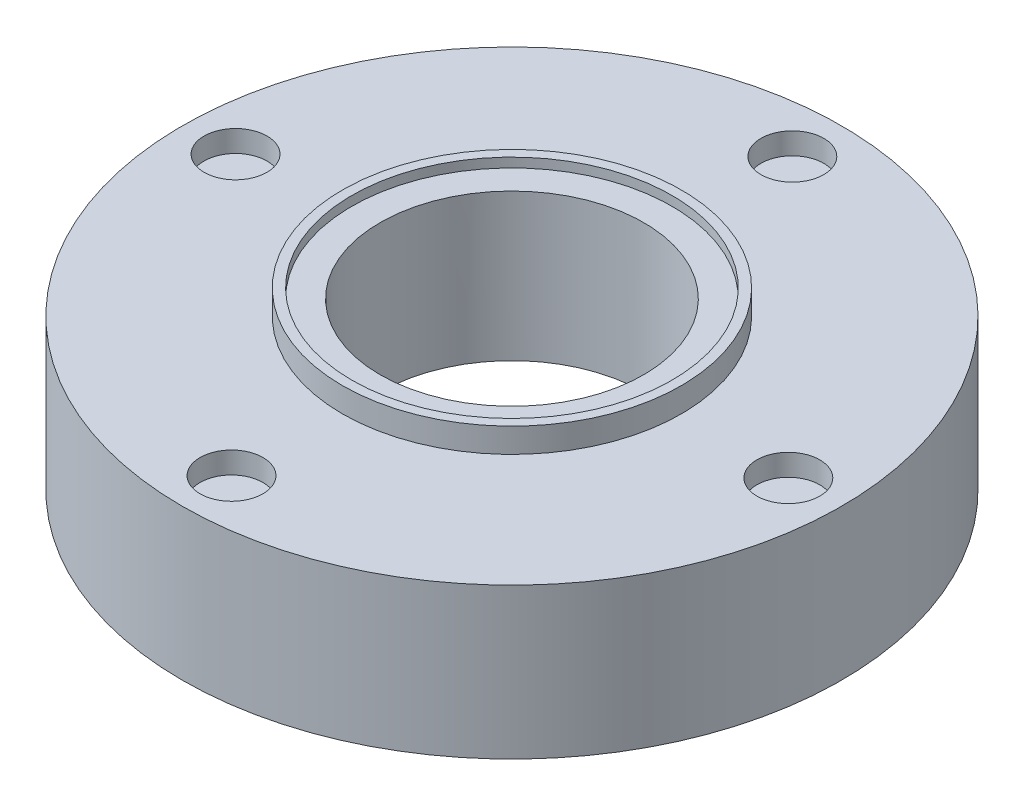
ISO-10303-21;
HEADER;
FILE_DESCRIPTION(('STEP AP214'),'2;1');
FILE_NAME('part.step','',(''),(''),'','','');
FILE_SCHEMA(('AUTOMOTIVE_DESIGN { 1 0 10303 214 1 1 1 1 }'));
ENDSEC;
DATA;
#1=APPLICATION_CONTEXT('core data for automotive mechanical design processes');
#2=APPLICATION_PROTOCOL_DEFINITION('international standard','automotive_design',2000,#1);
#3=PRODUCT_CONTEXT('',#1,'mechanical');
#4=PRODUCT('Part','Part','',(#3));
#5=PRODUCT_RELATED_PRODUCT_CATEGORY('part','',(#4));
#6=PRODUCT_DEFINITION_FORMATION('','',#4);
#7=PRODUCT_DEFINITION_CONTEXT('part definition',#1,'design');
#8=PRODUCT_DEFINITION('design','',#6,#7);
#9=PRODUCT_DEFINITION_SHAPE('','',#8);
#10=(LENGTH_UNIT() NAMED_UNIT(*) SI_UNIT(.MILLI.,.METRE.));
#11=(NAMED_UNIT(*) PLANE_ANGLE_UNIT() SI_UNIT($,.RADIAN.));
#12=(NAMED_UNIT(*) SI_UNIT($,.STERADIAN.) SOLID_ANGLE_UNIT());
#13=UNCERTAINTY_MEASURE_WITH_UNIT(LENGTH_MEASURE(1.E-05),#10,'distance_accuracy_value','');
#14=(GEOMETRIC_REPRESENTATION_CONTEXT(3) GLOBAL_UNCERTAINTY_ASSIGNED_CONTEXT((#13)) GLOBAL_UNIT_ASSIGNED_CONTEXT((#10,
#11,#12)) REPRESENTATION_CONTEXT('',''));
#15=CARTESIAN_POINT('',(0.,0.,0.));
#16=DIRECTION('',(0.,0.,1.));
#17=DIRECTION('',(1.,0.,0.));
#18=AXIS2_PLACEMENT_3D('',#15,#16,#17);
#19=CARTESIAN_POINT('',(0.,8.,0.));
#20=DIRECTION('',(0.,1.,0.));
#21=DIRECTION('',(0.,0.,1.));
#22=AXIS2_PLACEMENT_3D('',#19,#20,#21);
#23=PLANE('',#22);
#24=CARTESIAN_POINT('',(14.7834126807695,8.,0.106708515967393));
#25=DIRECTION('',(0.,1.,0.));
#26=DIRECTION('',(-1.,0.,0.));
#27=AXIS2_PLACEMENT_3D('',#24,#25,#26);
#28=CIRCLE('',#27,1.67);
#29=CARTESIAN_POINT('',(13.1134126807695,8.,0.106708515967411));
#30=VERTEX_POINT('',#29);
#31=EDGE_CURVE('E77',#30,#30,#28,.T.);
#32=ORIENTED_EDGE('',*,*,#31,.F.);
#33=EDGE_LOOP('',(#32));
#34=FACE_BOUND('',#33,.T.);
#35=CARTESIAN_POINT('',(-0.106708515967548,8.,14.7834126807695));
#36=DIRECTION('',(0.,1.,0.));
#37=DIRECTION('',(0.,0.,-1.));
#38=AXIS2_PLACEMENT_3D('',#35,#36,#37);
#39=CIRCLE('',#38,1.67);
#40=CARTESIAN_POINT('',(-0.106708515967548,8.,13.1134126807695));
#41=VERTEX_POINT('',#40);
#42=EDGE_CURVE('E71',#41,#41,#39,.T.);
#43=ORIENTED_EDGE('',*,*,#42,.F.);
#44=EDGE_LOOP('',(#43));
#45=FACE_BOUND('',#44,.T.);
#46=CARTESIAN_POINT('',(-14.7834126807695,8.,-0.106708515967496));
#47=DIRECTION('',(0.,1.,0.));
#48=DIRECTION('',(1.,0.,0.));
#49=AXIS2_PLACEMENT_3D('',#46,#47,#48);
#50=CIRCLE('',#49,1.67);
#51=CARTESIAN_POINT('',(-13.1134126807695,8.,-0.106708515967502));
#52=VERTEX_POINT('',#51);
#53=EDGE_CURVE('E65',#52,#52,#50,.T.);
#54=ORIENTED_EDGE('',*,*,#53,.F.);
#55=EDGE_LOOP('',(#54));
#56=FACE_BOUND('',#55,.T.);
#57=CARTESIAN_POINT('',(0.106708515967548,8.,-14.7834126807695));
#58=DIRECTION('',(0.,1.,0.));
#59=DIRECTION('',(0.,0.,1.));
#60=AXIS2_PLACEMENT_3D('',#57,#58,#59);
#61=CIRCLE('',#60,1.67);
#62=CARTESIAN_POINT('',(0.106708515967548,8.,-13.1134126807695));
#63=VERTEX_POINT('',#62);
#64=EDGE_CURVE('E59',#63,#63,#61,.T.);
#65=ORIENTED_EDGE('',*,*,#64,.F.);
#66=EDGE_LOOP('',(#65));
#67=FACE_BOUND('',#66,.T.);
#68=CARTESIAN_POINT('',(0.,8.,0.));
#69=DIRECTION('',(0.,1.,0.));
#70=DIRECTION('',(0.,0.,1.));
#71=AXIS2_PLACEMENT_3D('',#68,#69,#70);
#72=CIRCLE('',#71,17.5);
#73=CARTESIAN_POINT('',(0.,8.,17.5));
#74=VERTEX_POINT('',#73);
#75=EDGE_CURVE('E42',#74,#74,#72,.T.);
#76=ORIENTED_EDGE('',*,*,#75,.T.);
#77=EDGE_LOOP('',(#76));
#78=FACE_BOUND('',#77,.T.);
#79=CARTESIAN_POINT('',(0.,8.,0.));
#80=DIRECTION('',(0.,1.,0.));
#81=DIRECTION('',(0.,0.,1.));
#82=AXIS2_PLACEMENT_3D('',#79,#80,#81);
#83=CIRCLE('',#82,9.);
#84=CARTESIAN_POINT('',(0.,8.,9.));
#85=VERTEX_POINT('',#84);
#86=EDGE_CURVE('E83',#85,#85,#83,.T.);
#87=ORIENTED_EDGE('',*,*,#86,.F.);
#88=EDGE_LOOP('',(#87));
#89=FACE_BOUND('',#88,.T.);
#90=ADVANCED_FACE('F35',(#34,#45,#56,#67,#78,#89),#23,.T.);
#91=CARTESIAN_POINT('',(0.,8.,0.));
#92=DIRECTION('',(0.,-1.,0.));
#93=DIRECTION('',(0.,0.,-1.));
#94=AXIS2_PLACEMENT_3D('',#91,#92,#93);
#95=CYLINDRICAL_SURFACE('',#94,17.5);
#96=ORIENTED_EDGE('',*,*,#75,.F.);
#97=EDGE_LOOP('',(#96));
#98=FACE_BOUND('',#97,.T.);
#99=CARTESIAN_POINT('',(0.,0.,0.));
#100=DIRECTION('',(0.,1.,0.));
#101=DIRECTION('',(0.,0.,1.));
#102=AXIS2_PLACEMENT_3D('',#99,#100,#101);
#103=CIRCLE('',#102,17.5);
#104=CARTESIAN_POINT('',(0.,0.,17.5));
#105=VERTEX_POINT('',#104);
#106=EDGE_CURVE('E46',#105,#105,#103,.T.);
#107=ORIENTED_EDGE('',*,*,#106,.T.);
#108=EDGE_LOOP('',(#107));
#109=FACE_BOUND('',#108,.T.);
#110=ADVANCED_FACE('F37',(#98,#109),#95,.T.);
#111=CARTESIAN_POINT('',(0.,0.,0.));
#112=DIRECTION('',(0.,1.,0.));
#113=DIRECTION('',(0.,0.,1.));
#114=AXIS2_PLACEMENT_3D('',#111,#112,#113);
#115=PLANE('',#114);
#116=CARTESIAN_POINT('',(0.,0.,0.));
#117=DIRECTION('',(0.,-1.,0.));
#118=DIRECTION('',(0.,0.,-1.));
#119=AXIS2_PLACEMENT_3D('',#116,#117,#118);
#120=CIRCLE('',#119,16.5);
#121=CARTESIAN_POINT('',(0.,0.,-16.5));
#122=VERTEX_POINT('',#121);
#123=EDGE_CURVE('E53',#122,#122,#120,.T.);
#124=ORIENTED_EDGE('',*,*,#123,.F.);
#125=EDGE_LOOP('',(#124));
#126=FACE_BOUND('',#125,.T.);
#127=ORIENTED_EDGE('',*,*,#106,.F.);
#128=EDGE_LOOP('',(#127));
#129=FACE_BOUND('',#128,.T.);
#130=ADVANCED_FACE('F119',(#126,#129),#115,.F.);
#131=CARTESIAN_POINT('',(0.,1.,0.));
#132=DIRECTION('',(0.,-1.,0.));
#133=DIRECTION('',(0.,0.,-1.));
#134=AXIS2_PLACEMENT_3D('',#131,#132,#133);
#135=CYLINDRICAL_SURFACE('',#134,16.5);
#136=CARTESIAN_POINT('',(0.,1.,0.));
#137=DIRECTION('',(0.,-1.,0.));
#138=DIRECTION('',(0.,0.,-1.));
#139=AXIS2_PLACEMENT_3D('',#136,#137,#138);
#140=CIRCLE('',#139,16.5);
#141=CARTESIAN_POINT('',(0.,1.,-16.5));
#142=VERTEX_POINT('',#141);
#143=EDGE_CURVE('E51',#142,#142,#140,.T.);
#144=ORIENTED_EDGE('',*,*,#143,.F.);
#145=EDGE_LOOP('',(#144));
#146=FACE_BOUND('',#145,.T.);
#147=ORIENTED_EDGE('',*,*,#123,.T.);
#148=EDGE_LOOP('',(#147));
#149=FACE_BOUND('',#148,.T.);
#150=ADVANCED_FACE('F124',(#146,#149),#135,.F.);
#151=CARTESIAN_POINT('',(0.,1.,0.));
#152=DIRECTION('',(0.,-1.,0.));
#153=DIRECTION('',(0.,0.,-1.));
#154=AXIS2_PLACEMENT_3D('',#151,#152,#153);
#155=PLANE('',#154);
#156=CARTESIAN_POINT('',(0.,1.,0.));
#157=DIRECTION('',(0.,-1.,0.));
#158=DIRECTION('',(0.,0.,-1.));
#159=AXIS2_PLACEMENT_3D('',#156,#157,#158);
#160=CIRCLE('',#159,7.);
#161=CARTESIAN_POINT('',(0.,1.,-7.));
#162=VERTEX_POINT('',#161);
#163=EDGE_CURVE('E91',#162,#162,#160,.T.);
#164=ORIENTED_EDGE('',*,*,#163,.F.);
#165=EDGE_LOOP('',(#164));
#166=FACE_BOUND('',#165,.T.);
#167=ORIENTED_EDGE('',*,*,#143,.T.);
#168=EDGE_LOOP('',(#167));
#169=FACE_BOUND('',#168,.T.);
#170=ADVANCED_FACE('F131',(#166,#169),#155,.T.);
#171=CARTESIAN_POINT('',(0.106708515967548,6.85,-14.7834126807695));
#172=DIRECTION('',(0.,1.,0.));
#173=DIRECTION('',(0.,0.,1.));
#174=AXIS2_PLACEMENT_3D('',#171,#172,#173);
#175=CYLINDRICAL_SURFACE('',#174,1.67);
#176=CARTESIAN_POINT('',(0.106708515967548,6.85,-14.7834126807695));
#177=DIRECTION('',(0.,1.,0.));
#178=DIRECTION('',(0.,0.,1.));
#179=AXIS2_PLACEMENT_3D('',#176,#177,#178);
#180=CIRCLE('',#179,1.67);
#181=CARTESIAN_POINT('',(0.106708515967548,6.85,-13.1134126807695));
#182=VERTEX_POINT('',#181);
#183=EDGE_CURVE('E56',#182,#182,#180,.T.);
#184=ORIENTED_EDGE('',*,*,#183,.F.);
#185=EDGE_LOOP('',(#184));
#186=FACE_BOUND('',#185,.T.);
#187=ORIENTED_EDGE('',*,*,#64,.T.);
#188=EDGE_LOOP('',(#187));
#189=FACE_BOUND('',#188,.T.);
#190=ADVANCED_FACE('F141',(#186,#189),#175,.F.);
#191=CARTESIAN_POINT('',(0.106708515967548,6.85,-14.7834126807695));
#192=DIRECTION('',(0.,1.,0.));
#193=DIRECTION('',(0.,0.,1.));
#194=AXIS2_PLACEMENT_3D('',#191,#192,#193);
#195=PLANE('',#194);
#196=ORIENTED_EDGE('',*,*,#183,.T.);
#197=EDGE_LOOP('',(#196));
#198=FACE_BOUND('',#197,.T.);
#199=ADVANCED_FACE('F148',(#198),#195,.T.);
#200=CARTESIAN_POINT('',(-14.7834126807695,6.85,-0.106708515967496));
#201=DIRECTION('',(0.,1.,0.));
#202=DIRECTION('',(0.,0.,1.));
#203=AXIS2_PLACEMENT_3D('',#200,#201,#202);
#204=CYLINDRICAL_SURFACE('',#203,1.67);
#205=CARTESIAN_POINT('',(-14.7834126807695,6.85,-0.106708515967496));
#206=DIRECTION('',(0.,1.,0.));
#207=DIRECTION('',(1.,0.,0.));
#208=AXIS2_PLACEMENT_3D('',#205,#206,#207);
#209=CIRCLE('',#208,1.67);
#210=CARTESIAN_POINT('',(-13.1134126807695,6.85,-0.106708515967502));
#211=VERTEX_POINT('',#210);
#212=EDGE_CURVE('E62',#211,#211,#209,.T.);
#213=ORIENTED_EDGE('',*,*,#212,.F.);
#214=EDGE_LOOP('',(#213));
#215=FACE_BOUND('',#214,.T.);
#216=ORIENTED_EDGE('',*,*,#53,.T.);
#217=EDGE_LOOP('',(#216));
#218=FACE_BOUND('',#217,.T.);
#219=ADVANCED_FACE('F155',(#215,#218),#204,.F.);
#220=CARTESIAN_POINT('',(-14.7834126807695,6.85,-0.106708515967496));
#221=DIRECTION('',(0.,1.,0.));
#222=DIRECTION('',(1.,0.,0.));
#223=AXIS2_PLACEMENT_3D('',#220,#221,#222);
#224=PLANE('',#223);
#225=ORIENTED_EDGE('',*,*,#212,.T.);
#226=EDGE_LOOP('',(#225));
#227=FACE_BOUND('',#226,.T.);
#228=ADVANCED_FACE('F159',(#227),#224,.T.);
#229=CARTESIAN_POINT('',(-0.106708515967548,6.85,14.7834126807695));
#230=DIRECTION('',(0.,1.,0.));
#231=DIRECTION('',(0.,0.,1.));
#232=AXIS2_PLACEMENT_3D('',#229,#230,#231);
#233=CYLINDRICAL_SURFACE('',#232,1.67);
#234=CARTESIAN_POINT('',(-0.106708515967548,6.85,14.7834126807695));
#235=DIRECTION('',(0.,1.,0.));
#236=DIRECTION('',(0.,0.,-1.));
#237=AXIS2_PLACEMENT_3D('',#234,#235,#236);
#238=CIRCLE('',#237,1.67);
#239=CARTESIAN_POINT('',(-0.106708515967548,6.85,13.1134126807695));
#240=VERTEX_POINT('',#239);
#241=EDGE_CURVE('E68',#240,#240,#238,.T.);
#242=ORIENTED_EDGE('',*,*,#241,.F.);
#243=EDGE_LOOP('',(#242));
#244=FACE_BOUND('',#243,.T.);
#245=ORIENTED_EDGE('',*,*,#42,.T.);
#246=EDGE_LOOP('',(#245));
#247=FACE_BOUND('',#246,.T.);
#248=ADVANCED_FACE('F163',(#244,#247),#233,.F.);
#249=CARTESIAN_POINT('',(-0.106708515967548,6.85,14.7834126807695));
#250=DIRECTION('',(0.,1.,0.));
#251=DIRECTION('',(0.,0.,-1.));
#252=AXIS2_PLACEMENT_3D('',#249,#250,#251);
#253=PLANE('',#252);
#254=ORIENTED_EDGE('',*,*,#241,.T.);
#255=EDGE_LOOP('',(#254));
#256=FACE_BOUND('',#255,.T.);
#257=ADVANCED_FACE('F167',(#256),#253,.T.);
#258=CARTESIAN_POINT('',(14.7834126807695,6.85,0.106708515967393));
#259=DIRECTION('',(0.,1.,0.));
#260=DIRECTION('',(0.,0.,1.));
#261=AXIS2_PLACEMENT_3D('',#258,#259,#260);
#262=CYLINDRICAL_SURFACE('',#261,1.67);
#263=CARTESIAN_POINT('',(14.7834126807695,6.85,0.106708515967393));
#264=DIRECTION('',(0.,1.,0.));
#265=DIRECTION('',(-1.,0.,0.));
#266=AXIS2_PLACEMENT_3D('',#263,#264,#265);
#267=CIRCLE('',#266,1.67);
#268=CARTESIAN_POINT('',(13.1134126807695,6.85,0.106708515967411));
#269=VERTEX_POINT('',#268);
#270=EDGE_CURVE('E74',#269,#269,#267,.T.);
#271=ORIENTED_EDGE('',*,*,#270,.F.);
#272=EDGE_LOOP('',(#271));
#273=FACE_BOUND('',#272,.T.);
#274=ORIENTED_EDGE('',*,*,#31,.T.);
#275=EDGE_LOOP('',(#274));
#276=FACE_BOUND('',#275,.T.);
#277=ADVANCED_FACE('F171',(#273,#276),#262,.F.);
#278=CARTESIAN_POINT('',(14.7834126807695,6.85,0.106708515967393));
#279=DIRECTION('',(0.,1.,0.));
#280=DIRECTION('',(-1.,0.,0.));
#281=AXIS2_PLACEMENT_3D('',#278,#279,#280);
#282=PLANE('',#281);
#283=ORIENTED_EDGE('',*,*,#270,.T.);
#284=EDGE_LOOP('',(#283));
#285=FACE_BOUND('',#284,.T.);
#286=ADVANCED_FACE('F175',(#285),#282,.T.);
#287=CARTESIAN_POINT('',(0.,9.3,0.));
#288=DIRECTION('',(0.,1.,0.));
#289=DIRECTION('',(0.,0.,1.));
#290=AXIS2_PLACEMENT_3D('',#287,#288,#289);
#291=PLANE('',#290);
#292=CARTESIAN_POINT('',(0.,9.3,0.));
#293=DIRECTION('',(0.,1.,0.));
#294=DIRECTION('',(0.,0.,1.));
#295=AXIS2_PLACEMENT_3D('',#292,#293,#294);
#296=CIRCLE('',#295,9.);
#297=CARTESIAN_POINT('',(0.,9.3,9.));
#298=VERTEX_POINT('',#297);
#299=EDGE_CURVE('E80',#298,#298,#296,.T.);
#300=ORIENTED_EDGE('',*,*,#299,.T.);
#301=EDGE_LOOP('',(#300));
#302=FACE_BOUND('',#301,.T.);
#303=CARTESIAN_POINT('',(0.,9.3,0.));
#304=DIRECTION('',(0.,1.,0.));
#305=DIRECTION('',(0.,0.,1.));
#306=AXIS2_PLACEMENT_3D('',#303,#304,#305);
#307=CIRCLE('',#306,8.5);
#308=CARTESIAN_POINT('',(0.,9.3,8.5));
#309=VERTEX_POINT('',#308);
#310=EDGE_CURVE('E86',#309,#309,#307,.T.);
#311=ORIENTED_EDGE('',*,*,#310,.F.);
#312=EDGE_LOOP('',(#311));
#313=FACE_BOUND('',#312,.T.);
#314=ADVANCED_FACE('F179',(#302,#313),#291,.T.);
#315=CARTESIAN_POINT('',(0.,9.3,0.));
#316=DIRECTION('',(0.,-1.,0.));
#317=DIRECTION('',(0.,0.,-1.));
#318=AXIS2_PLACEMENT_3D('',#315,#316,#317);
#319=CYLINDRICAL_SURFACE('',#318,9.);
#320=ORIENTED_EDGE('',*,*,#299,.F.);
#321=EDGE_LOOP('',(#320));
#322=FACE_BOUND('',#321,.T.);
#323=ORIENTED_EDGE('',*,*,#86,.T.);
#324=EDGE_LOOP('',(#323));
#325=FACE_BOUND('',#324,.T.);
#326=ADVANCED_FACE('F110',(#322,#325),#319,.T.);
#327=CARTESIAN_POINT('',(0.,9.3,0.));
#328=DIRECTION('',(0.,-1.,0.));
#329=DIRECTION('',(0.,0.,-1.));
#330=AXIS2_PLACEMENT_3D('',#327,#328,#329);
#331=CYLINDRICAL_SURFACE('',#330,8.5);
#332=CARTESIAN_POINT('',(0.,8.8,0.));
#333=DIRECTION('',(0.,1.,0.));
#334=DIRECTION('',(0.,0.,1.));
#335=AXIS2_PLACEMENT_3D('',#332,#333,#334);
#336=CIRCLE('',#335,8.5);
#337=CARTESIAN_POINT('',(0.,8.8,8.5));
#338=VERTEX_POINT('',#337);
#339=EDGE_CURVE('E10',#338,#338,#336,.T.);
#340=ORIENTED_EDGE('',*,*,#339,.F.);
#341=EDGE_LOOP('',(#340));
#342=FACE_BOUND('',#341,.T.);
#343=ORIENTED_EDGE('',*,*,#310,.T.);
#344=EDGE_LOOP('',(#343));
#345=FACE_BOUND('',#344,.T.);
#346=ADVANCED_FACE('F102',(#342,#345),#331,.F.);
#347=CARTESIAN_POINT('',(0.,8.8,0.));
#348=DIRECTION('',(0.,1.,0.));
#349=DIRECTION('',(0.,0.,1.));
#350=AXIS2_PLACEMENT_3D('',#347,#348,#349);
#351=PLANE('',#350);
#352=CARTESIAN_POINT('',(0.,8.8,0.));
#353=DIRECTION('',(0.,1.,0.));
#354=DIRECTION('',(0.,0.,1.));
#355=AXIS2_PLACEMENT_3D('',#352,#353,#354);
#356=CIRCLE('',#355,7.);
#357=CARTESIAN_POINT('',(0.,8.8,7.));
#358=VERTEX_POINT('',#357);
#359=EDGE_CURVE('E94',#358,#358,#356,.T.);
#360=ORIENTED_EDGE('',*,*,#359,.F.);
#361=EDGE_LOOP('',(#360));
#362=FACE_BOUND('',#361,.T.);
#363=ORIENTED_EDGE('',*,*,#339,.T.);
#364=EDGE_LOOP('',(#363));
#365=FACE_BOUND('',#364,.T.);
#366=ADVANCED_FACE('F100',(#362,#365),#351,.T.);
#367=CARTESIAN_POINT('',(0.,0.,0.));
#368=DIRECTION('',(0.,1.,0.));
#369=DIRECTION('',(0.,0.,1.));
#370=AXIS2_PLACEMENT_3D('',#367,#368,#369);
#371=CYLINDRICAL_SURFACE('',#370,7.);
#372=ORIENTED_EDGE('',*,*,#163,.T.);
#373=EDGE_LOOP('',(#372));
#374=FACE_BOUND('',#373,.T.);
#375=ORIENTED_EDGE('',*,*,#359,.T.);
#376=EDGE_LOOP('',(#375));
#377=FACE_BOUND('',#376,.T.);
#378=ADVANCED_FACE('F98',(#374,#377),#371,.F.);
#379=CLOSED_SHELL('',(#90,#110,#130,#150,#170,#190,#199,#219,#228,#248,#257,#277,#286,#314,#326,
#346,#366,#378));
#380=MANIFOLD_SOLID_BREP('B2',#379);
#381=ADVANCED_BREP_SHAPE_REPRESENTATION('',(#18,#380),#14);
#382=SHAPE_DEFINITION_REPRESENTATION(#9,#381);
ENDSEC;
END-ISO-10303-21;
